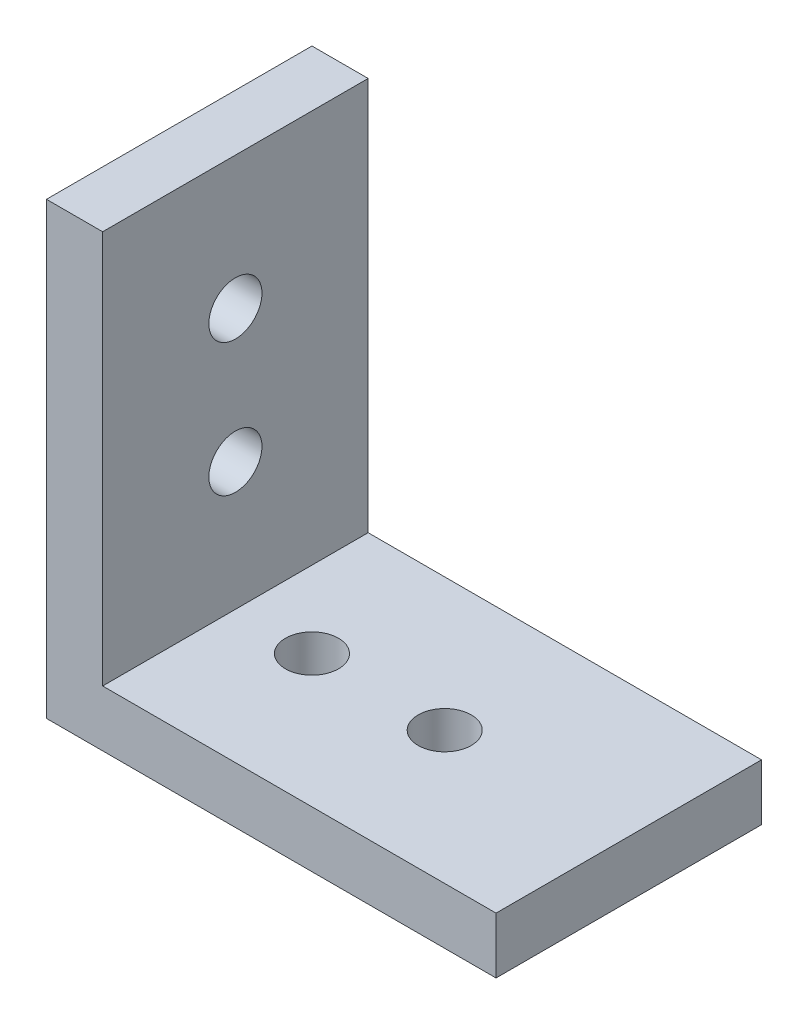
ISO-10303-21;
HEADER;
FILE_DESCRIPTION(('STEP AP214'),'2;1');
FILE_NAME('part.step','',(''),(''),'','','');
FILE_SCHEMA(('AUTOMOTIVE_DESIGN { 1 0 10303 214 1 1 1 1 }'));
ENDSEC;
DATA;
#1=APPLICATION_CONTEXT('core data for automotive mechanical design processes');
#2=APPLICATION_PROTOCOL_DEFINITION('international standard','automotive_design',2000,#1);
#3=PRODUCT_CONTEXT('',#1,'mechanical');
#4=PRODUCT('Part','Part','',(#3));
#5=PRODUCT_RELATED_PRODUCT_CATEGORY('part','',(#4));
#6=PRODUCT_DEFINITION_FORMATION('','',#4);
#7=PRODUCT_DEFINITION_CONTEXT('part definition',#1,'design');
#8=PRODUCT_DEFINITION('design','',#6,#7);
#9=PRODUCT_DEFINITION_SHAPE('','',#8);
#10=(LENGTH_UNIT() NAMED_UNIT(*) SI_UNIT(.MILLI.,.METRE.));
#11=(NAMED_UNIT(*) PLANE_ANGLE_UNIT() SI_UNIT($,.RADIAN.));
#12=(NAMED_UNIT(*) SI_UNIT($,.STERADIAN.) SOLID_ANGLE_UNIT());
#13=UNCERTAINTY_MEASURE_WITH_UNIT(LENGTH_MEASURE(1.E-05),#10,'distance_accuracy_value','');
#14=(GEOMETRIC_REPRESENTATION_CONTEXT(3) GLOBAL_UNCERTAINTY_ASSIGNED_CONTEXT((#13)) GLOBAL_UNIT_ASSIGNED_CONTEXT((#10,
#11,#12)) REPRESENTATION_CONTEXT('',''));
#15=CARTESIAN_POINT('',(0.,0.,0.));
#16=DIRECTION('',(0.,0.,1.));
#17=DIRECTION('',(1.,0.,0.));
#18=AXIS2_PLACEMENT_3D('',#15,#16,#17);
#19=CARTESIAN_POINT('',(3.175,0.,0.));
#20=DIRECTION('',(-1.,0.,0.));
#21=DIRECTION('',(0.,0.,1.));
#22=AXIS2_PLACEMENT_3D('',#19,#20,#21);
#23=PLANE('',#22);
#24=CARTESIAN_POINT('',(3.175,17.9,-7.5));
#25=DIRECTION('',(1.,0.,0.));
#26=DIRECTION('',(0.,0.,-1.));
#27=AXIS2_PLACEMENT_3D('',#24,#25,#26);
#28=CIRCLE('',#27,1.5);
#29=CARTESIAN_POINT('',(3.175,17.9,-9.));
#30=VERTEX_POINT('',#29);
#31=EDGE_CURVE('E243',#30,#30,#28,.T.);
#32=ORIENTED_EDGE('',*,*,#31,.F.);
#33=EDGE_LOOP('',(#32));
#34=FACE_BOUND('',#33,.T.);
#35=CARTESIAN_POINT('',(3.175,10.4,-7.5));
#36=DIRECTION('',(1.,0.,0.));
#37=DIRECTION('',(0.,0.,-1.));
#38=AXIS2_PLACEMENT_3D('',#35,#36,#37);
#39=CIRCLE('',#38,1.5);
#40=CARTESIAN_POINT('',(3.175,10.4,-9.));
#41=VERTEX_POINT('',#40);
#42=EDGE_CURVE('E245',#41,#41,#39,.T.);
#43=ORIENTED_EDGE('',*,*,#42,.F.);
#44=EDGE_LOOP('',(#43));
#45=FACE_BOUND('',#44,.T.);
#46=DIRECTION('',(0.,0.,1.));
#47=VECTOR('',#46,1.);
#48=CARTESIAN_POINT('',(3.175,3.175,0.));
#49=LINE('',#48,#47);
#50=CARTESIAN_POINT('',(3.175,3.175,-15.));
#51=VERTEX_POINT('',#50);
#52=CARTESIAN_POINT('',(3.175,3.175,0.));
#53=VERTEX_POINT('',#52);
#54=EDGE_CURVE('E56',#51,#53,#49,.T.);
#55=ORIENTED_EDGE('',*,*,#54,.F.);
#56=DIRECTION('',(0.,1.,0.));
#57=VECTOR('',#56,1.);
#58=CARTESIAN_POINT('',(3.175,0.,-15.));
#59=LINE('',#58,#57);
#60=CARTESIAN_POINT('',(3.175,25.4,-15.));
#61=VERTEX_POINT('',#60);
#62=EDGE_CURVE('E165',#51,#61,#59,.T.);
#63=ORIENTED_EDGE('',*,*,#62,.T.);
#64=DIRECTION('',(0.,0.,1.));
#65=VECTOR('',#64,1.);
#66=CARTESIAN_POINT('',(3.175,25.4,0.));
#67=LINE('',#66,#65);
#68=CARTESIAN_POINT('',(3.175,25.4,0.));
#69=VERTEX_POINT('',#68);
#70=EDGE_CURVE('E62',#61,#69,#67,.T.);
#71=ORIENTED_EDGE('',*,*,#70,.T.);
#72=DIRECTION('',(0.,-1.,0.));
#73=VECTOR('',#72,1.);
#74=CARTESIAN_POINT('',(3.175,0.,0.));
#75=LINE('',#74,#73);
#76=EDGE_CURVE('E92',#69,#53,#75,.T.);
#77=ORIENTED_EDGE('',*,*,#76,.T.);
#78=EDGE_LOOP('',(#55,#63,#71,#77));
#79=FACE_BOUND('',#78,.T.);
#80=ADVANCED_FACE('F38',(#34,#45,#79),#23,.F.);
#81=CARTESIAN_POINT('',(3.175,0.,0.));
#82=DIRECTION('',(0.,0.,-1.));
#83=DIRECTION('',(-1.,0.,0.));
#84=AXIS2_PLACEMENT_3D('',#81,#82,#83);
#85=PLANE('',#84);
#86=DIRECTION('',(0.,-1.,0.));
#87=VECTOR('',#86,1.);
#88=CARTESIAN_POINT('',(0.,0.,0.));
#89=LINE('',#88,#87);
#90=CARTESIAN_POINT('',(0.,25.4,0.));
#91=VERTEX_POINT('',#90);
#92=CARTESIAN_POINT('',(0.,0.,0.));
#93=VERTEX_POINT('',#92);
#94=EDGE_CURVE('E98',#91,#93,#89,.T.);
#95=ORIENTED_EDGE('',*,*,#94,.T.);
#96=DIRECTION('',(-1.,0.,0.));
#97=VECTOR('',#96,1.);
#98=CARTESIAN_POINT('',(3.175,0.,0.));
#99=LINE('',#98,#97);
#100=CARTESIAN_POINT('',(25.4,0.,0.));
#101=VERTEX_POINT('',#100);
#102=EDGE_CURVE('E11',#101,#93,#99,.T.);
#103=ORIENTED_EDGE('',*,*,#102,.F.);
#104=DIRECTION('',(0.,-1.,0.));
#105=VECTOR('',#104,1.);
#106=CARTESIAN_POINT('',(25.4,0.,0.));
#107=LINE('',#106,#105);
#108=CARTESIAN_POINT('',(25.4,3.175,0.));
#109=VERTEX_POINT('',#108);
#110=EDGE_CURVE('E144',#109,#101,#107,.T.);
#111=ORIENTED_EDGE('',*,*,#110,.F.);
#112=DIRECTION('',(-1.,0.,0.));
#113=VECTOR('',#112,1.);
#114=CARTESIAN_POINT('',(25.4,3.175,0.));
#115=LINE('',#114,#113);
#116=EDGE_CURVE('E111',#109,#53,#115,.T.);
#117=ORIENTED_EDGE('',*,*,#116,.T.);
#118=ORIENTED_EDGE('',*,*,#76,.F.);
#119=DIRECTION('',(-1.,0.,0.));
#120=VECTOR('',#119,1.);
#121=CARTESIAN_POINT('',(3.175,25.4,0.));
#122=LINE('',#121,#120);
#123=EDGE_CURVE('E84',#69,#91,#122,.T.);
#124=ORIENTED_EDGE('',*,*,#123,.T.);
#125=EDGE_LOOP('',(#95,#103,#111,#117,#118,#124));
#126=FACE_BOUND('',#125,.T.);
#127=ADVANCED_FACE('F40',(#126),#85,.F.);
#128=CARTESIAN_POINT('',(3.175,0.,0.));
#129=DIRECTION('',(0.,1.,0.));
#130=DIRECTION('',(0.,0.,1.));
#131=AXIS2_PLACEMENT_3D('',#128,#129,#130);
#132=PLANE('',#131);
#133=CARTESIAN_POINT('',(7.5,0.,-7.5));
#134=DIRECTION('',(0.,-1.,0.));
#135=DIRECTION('',(0.,0.,-1.));
#136=AXIS2_PLACEMENT_3D('',#133,#134,#135);
#137=CIRCLE('',#136,1.5);
#138=CARTESIAN_POINT('',(7.5,0.,-9.));
#139=VERTEX_POINT('',#138);
#140=EDGE_CURVE('E125',#139,#139,#137,.T.);
#141=ORIENTED_EDGE('',*,*,#140,.F.);
#142=EDGE_LOOP('',(#141));
#143=FACE_BOUND('',#142,.T.);
#144=CARTESIAN_POINT('',(15.,0.,-7.5));
#145=DIRECTION('',(0.,-1.,0.));
#146=DIRECTION('',(0.,0.,-1.));
#147=AXIS2_PLACEMENT_3D('',#144,#145,#146);
#148=CIRCLE('',#147,1.5);
#149=CARTESIAN_POINT('',(15.,0.,-9.));
#150=VERTEX_POINT('',#149);
#151=EDGE_CURVE('E132',#150,#150,#148,.T.);
#152=ORIENTED_EDGE('',*,*,#151,.F.);
#153=EDGE_LOOP('',(#152));
#154=FACE_BOUND('',#153,.T.);
#155=DIRECTION('',(0.,0.,-1.));
#156=VECTOR('',#155,1.);
#157=CARTESIAN_POINT('',(0.,0.,0.));
#158=LINE('',#157,#156);
#159=CARTESIAN_POINT('',(0.,0.,-15.));
#160=VERTEX_POINT('',#159);
#161=EDGE_CURVE('E103',#93,#160,#158,.T.);
#162=ORIENTED_EDGE('',*,*,#161,.T.);
#163=DIRECTION('',(-1.,0.,0.));
#164=VECTOR('',#163,1.);
#165=CARTESIAN_POINT('',(3.175,0.,-15.));
#166=LINE('',#165,#164);
#167=CARTESIAN_POINT('',(25.4,0.,-15.));
#168=VERTEX_POINT('',#167);
#169=EDGE_CURVE('E48',#168,#160,#166,.T.);
#170=ORIENTED_EDGE('',*,*,#169,.F.);
#171=DIRECTION('',(0.,0.,-1.));
#172=VECTOR('',#171,1.);
#173=CARTESIAN_POINT('',(25.4,0.,0.));
#174=LINE('',#173,#172);
#175=EDGE_CURVE('E148',#101,#168,#174,.T.);
#176=ORIENTED_EDGE('',*,*,#175,.F.);
#177=ORIENTED_EDGE('',*,*,#102,.T.);
#178=EDGE_LOOP('',(#162,#170,#176,#177));
#179=FACE_BOUND('',#178,.T.);
#180=ADVANCED_FACE('F176',(#143,#154,#179),#132,.F.);
#181=CARTESIAN_POINT('',(3.175,0.,-15.));
#182=DIRECTION('',(0.,0.,1.));
#183=DIRECTION('',(1.,0.,0.));
#184=AXIS2_PLACEMENT_3D('',#181,#182,#183);
#185=PLANE('',#184);
#186=DIRECTION('',(0.,1.,0.));
#187=VECTOR('',#186,1.);
#188=CARTESIAN_POINT('',(0.,0.,-15.));
#189=LINE('',#188,#187);
#190=CARTESIAN_POINT('',(0.,25.4,-15.));
#191=VERTEX_POINT('',#190);
#192=EDGE_CURVE('E93',#160,#191,#189,.T.);
#193=ORIENTED_EDGE('',*,*,#192,.T.);
#194=DIRECTION('',(-1.,0.,0.));
#195=VECTOR('',#194,1.);
#196=CARTESIAN_POINT('',(3.175,25.4,-15.));
#197=LINE('',#196,#195);
#198=EDGE_CURVE('E87',#61,#191,#197,.T.);
#199=ORIENTED_EDGE('',*,*,#198,.F.);
#200=ORIENTED_EDGE('',*,*,#62,.F.);
#201=DIRECTION('',(-1.,0.,0.));
#202=VECTOR('',#201,1.);
#203=CARTESIAN_POINT('',(25.4,3.175,-15.));
#204=LINE('',#203,#202);
#205=CARTESIAN_POINT('',(25.4,3.175,-15.));
#206=VERTEX_POINT('',#205);
#207=EDGE_CURVE('E105',#206,#51,#204,.T.);
#208=ORIENTED_EDGE('',*,*,#207,.F.);
#209=DIRECTION('',(0.,1.,0.));
#210=VECTOR('',#209,1.);
#211=CARTESIAN_POINT('',(25.4,0.,-15.));
#212=LINE('',#211,#210);
#213=EDGE_CURVE('E152',#168,#206,#212,.T.);
#214=ORIENTED_EDGE('',*,*,#213,.F.);
#215=ORIENTED_EDGE('',*,*,#169,.T.);
#216=EDGE_LOOP('',(#193,#199,#200,#208,#214,#215));
#217=FACE_BOUND('',#216,.T.);
#218=ADVANCED_FACE('F170',(#217),#185,.F.);
#219=CARTESIAN_POINT('',(3.175,25.4,0.));
#220=DIRECTION('',(0.,-1.,0.));
#221=DIRECTION('',(0.,0.,-1.));
#222=AXIS2_PLACEMENT_3D('',#219,#220,#221);
#223=PLANE('',#222);
#224=DIRECTION('',(0.,0.,1.));
#225=VECTOR('',#224,1.);
#226=CARTESIAN_POINT('',(0.,25.4,0.));
#227=LINE('',#226,#225);
#228=EDGE_CURVE('E81',#191,#91,#227,.T.);
#229=ORIENTED_EDGE('',*,*,#228,.T.);
#230=ORIENTED_EDGE('',*,*,#123,.F.);
#231=ORIENTED_EDGE('',*,*,#70,.F.);
#232=ORIENTED_EDGE('',*,*,#198,.T.);
#233=EDGE_LOOP('',(#229,#230,#231,#232));
#234=FACE_BOUND('',#233,.T.);
#235=ADVANCED_FACE('F83',(#234),#223,.F.);
#236=CARTESIAN_POINT('',(0.,0.,0.));
#237=DIRECTION('',(-1.,0.,0.));
#238=DIRECTION('',(0.,0.,1.));
#239=AXIS2_PLACEMENT_3D('',#236,#237,#238);
#240=PLANE('',#239);
#241=CARTESIAN_POINT('',(0.,17.9,-7.5));
#242=DIRECTION('',(1.,0.,0.));
#243=DIRECTION('',(0.,0.,-1.));
#244=AXIS2_PLACEMENT_3D('',#241,#242,#243);
#245=CIRCLE('',#244,1.5);
#246=CARTESIAN_POINT('',(0.,17.9,-9.));
#247=VERTEX_POINT('',#246);
#248=EDGE_CURVE('E138',#247,#247,#245,.T.);
#249=ORIENTED_EDGE('',*,*,#248,.T.);
#250=EDGE_LOOP('',(#249));
#251=FACE_BOUND('',#250,.T.);
#252=CARTESIAN_POINT('',(0.,10.4,-7.5));
#253=DIRECTION('',(1.,0.,0.));
#254=DIRECTION('',(0.,0.,-1.));
#255=AXIS2_PLACEMENT_3D('',#252,#253,#254);
#256=CIRCLE('',#255,1.5);
#257=CARTESIAN_POINT('',(0.,10.4,-9.));
#258=VERTEX_POINT('',#257);
#259=EDGE_CURVE('E141',#258,#258,#256,.T.);
#260=ORIENTED_EDGE('',*,*,#259,.T.);
#261=EDGE_LOOP('',(#260));
#262=FACE_BOUND('',#261,.T.);
#263=ORIENTED_EDGE('',*,*,#94,.F.);
#264=ORIENTED_EDGE('',*,*,#228,.F.);
#265=ORIENTED_EDGE('',*,*,#192,.F.);
#266=ORIENTED_EDGE('',*,*,#161,.F.);
#267=EDGE_LOOP('',(#263,#264,#265,#266));
#268=FACE_BOUND('',#267,.T.);
#269=ADVANCED_FACE('F102',(#251,#262,#268),#240,.T.);
#270=CARTESIAN_POINT('',(25.4,3.175,0.));
#271=DIRECTION('',(0.,-1.,0.));
#272=DIRECTION('',(0.,0.,-1.));
#273=AXIS2_PLACEMENT_3D('',#270,#271,#272);
#274=PLANE('',#273);
#275=CARTESIAN_POINT('',(7.5,3.175,-7.5));
#276=DIRECTION('',(0.,-1.,0.));
#277=DIRECTION('',(0.,0.,-1.));
#278=AXIS2_PLACEMENT_3D('',#275,#276,#277);
#279=CIRCLE('',#278,1.5);
#280=CARTESIAN_POINT('',(7.5,3.175,-9.));
#281=VERTEX_POINT('',#280);
#282=EDGE_CURVE('E42',#281,#281,#279,.T.);
#283=ORIENTED_EDGE('',*,*,#282,.T.);
#284=EDGE_LOOP('',(#283));
#285=FACE_BOUND('',#284,.T.);
#286=CARTESIAN_POINT('',(15.,3.175,-7.5));
#287=DIRECTION('',(0.,-1.,0.));
#288=DIRECTION('',(0.,0.,-1.));
#289=AXIS2_PLACEMENT_3D('',#286,#287,#288);
#290=CIRCLE('',#289,1.5);
#291=CARTESIAN_POINT('',(15.,3.175,-9.));
#292=VERTEX_POINT('',#291);
#293=EDGE_CURVE('E122',#292,#292,#290,.T.);
#294=ORIENTED_EDGE('',*,*,#293,.T.);
#295=EDGE_LOOP('',(#294));
#296=FACE_BOUND('',#295,.T.);
#297=ORIENTED_EDGE('',*,*,#54,.T.);
#298=ORIENTED_EDGE('',*,*,#116,.F.);
#299=DIRECTION('',(0.,0.,1.));
#300=VECTOR('',#299,1.);
#301=CARTESIAN_POINT('',(25.4,3.175,0.));
#302=LINE('',#301,#300);
#303=EDGE_CURVE('E156',#206,#109,#302,.T.);
#304=ORIENTED_EDGE('',*,*,#303,.F.);
#305=ORIENTED_EDGE('',*,*,#207,.T.);
#306=EDGE_LOOP('',(#297,#298,#304,#305));
#307=FACE_BOUND('',#306,.T.);
#308=ADVANCED_FACE('F190',(#285,#296,#307),#274,.F.);
#309=CARTESIAN_POINT('',(25.4,0.,0.));
#310=DIRECTION('',(-1.,0.,0.));
#311=DIRECTION('',(0.,0.,1.));
#312=AXIS2_PLACEMENT_3D('',#309,#310,#311);
#313=PLANE('',#312);
#314=ORIENTED_EDGE('',*,*,#110,.T.);
#315=ORIENTED_EDGE('',*,*,#175,.T.);
#316=ORIENTED_EDGE('',*,*,#213,.T.);
#317=ORIENTED_EDGE('',*,*,#303,.T.);
#318=EDGE_LOOP('',(#314,#315,#316,#317));
#319=FACE_BOUND('',#318,.T.);
#320=ADVANCED_FACE('F181',(#319),#313,.F.);
#321=CARTESIAN_POINT('',(15.,25.4,-7.5));
#322=DIRECTION('',(0.,-1.,0.));
#323=DIRECTION('',(0.,0.,-1.));
#324=AXIS2_PLACEMENT_3D('',#321,#322,#323);
#325=CYLINDRICAL_SURFACE('',#324,1.5);
#326=ORIENTED_EDGE('',*,*,#151,.T.);
#327=EDGE_LOOP('',(#326));
#328=FACE_BOUND('',#327,.T.);
#329=ORIENTED_EDGE('',*,*,#293,.F.);
#330=EDGE_LOOP('',(#329));
#331=FACE_BOUND('',#330,.T.);
#332=ADVANCED_FACE('F198',(#328,#331),#325,.F.);
#333=CARTESIAN_POINT('',(7.5,25.4,-7.5));
#334=DIRECTION('',(0.,-1.,0.));
#335=DIRECTION('',(0.,0.,-1.));
#336=AXIS2_PLACEMENT_3D('',#333,#334,#335);
#337=CYLINDRICAL_SURFACE('',#336,1.5);
#338=ORIENTED_EDGE('',*,*,#140,.T.);
#339=EDGE_LOOP('',(#338));
#340=FACE_BOUND('',#339,.T.);
#341=ORIENTED_EDGE('',*,*,#282,.F.);
#342=EDGE_LOOP('',(#341));
#343=FACE_BOUND('',#342,.T.);
#344=ADVANCED_FACE('F223',(#340,#343),#337,.F.);
#345=CARTESIAN_POINT('',(0.,10.4,-7.5));
#346=DIRECTION('',(1.,0.,0.));
#347=DIRECTION('',(0.,0.,-1.));
#348=AXIS2_PLACEMENT_3D('',#345,#346,#347);
#349=CYLINDRICAL_SURFACE('',#348,1.5);
#350=ORIENTED_EDGE('',*,*,#259,.F.);
#351=EDGE_LOOP('',(#350));
#352=FACE_BOUND('',#351,.T.);
#353=ORIENTED_EDGE('',*,*,#42,.T.);
#354=EDGE_LOOP('',(#353));
#355=FACE_BOUND('',#354,.T.);
#356=ADVANCED_FACE('F228',(#352,#355),#349,.F.);
#357=CARTESIAN_POINT('',(0.,17.9,-7.5));
#358=DIRECTION('',(1.,0.,0.));
#359=DIRECTION('',(0.,0.,-1.));
#360=AXIS2_PLACEMENT_3D('',#357,#358,#359);
#361=CYLINDRICAL_SURFACE('',#360,1.5);
#362=ORIENTED_EDGE('',*,*,#248,.F.);
#363=EDGE_LOOP('',(#362));
#364=FACE_BOUND('',#363,.T.);
#365=ORIENTED_EDGE('',*,*,#31,.T.);
#366=EDGE_LOOP('',(#365));
#367=FACE_BOUND('',#366,.T.);
#368=ADVANCED_FACE('F233',(#364,#367),#361,.F.);
#369=CLOSED_SHELL('',(#80,#127,#180,#218,#235,#269,#308,#320,#332,#344,#356,#368));
#370=MANIFOLD_SOLID_BREP('B2',#369);
#371=ADVANCED_BREP_SHAPE_REPRESENTATION('',(#18,#370),#14);
#372=SHAPE_DEFINITION_REPRESENTATION(#9,#371);
ENDSEC;
END-ISO-10303-21;
